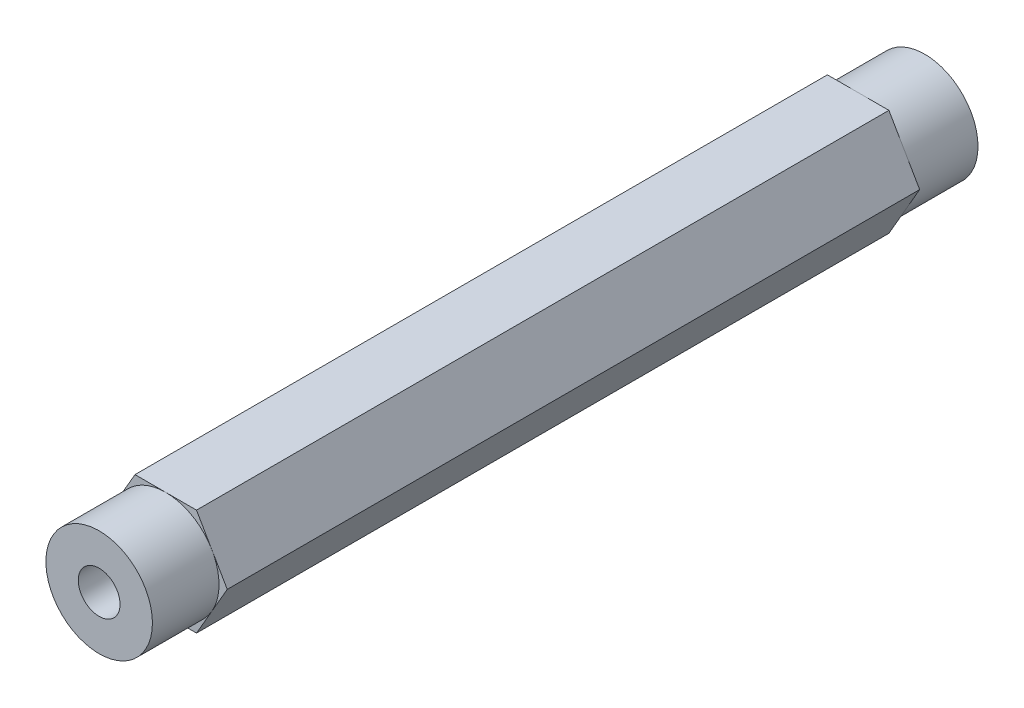
ISO-10303-21;
HEADER;
FILE_DESCRIPTION(('STEP AP214'),'2;1');
FILE_NAME('part.step','',(''),(''),'','','');
FILE_SCHEMA(('AUTOMOTIVE_DESIGN { 1 0 10303 214 1 1 1 1 }'));
ENDSEC;
DATA;
#1=APPLICATION_CONTEXT('core data for automotive mechanical design processes');
#2=APPLICATION_PROTOCOL_DEFINITION('international standard','automotive_design',2000,#1);
#3=PRODUCT_CONTEXT('',#1,'mechanical');
#4=PRODUCT('Part','Part','',(#3));
#5=PRODUCT_RELATED_PRODUCT_CATEGORY('part','',(#4));
#6=PRODUCT_DEFINITION_FORMATION('','',#4);
#7=PRODUCT_DEFINITION_CONTEXT('part definition',#1,'design');
#8=PRODUCT_DEFINITION('design','',#6,#7);
#9=PRODUCT_DEFINITION_SHAPE('','',#8);
#10=(LENGTH_UNIT() NAMED_UNIT(*) SI_UNIT(.MILLI.,.METRE.));
#11=(NAMED_UNIT(*) PLANE_ANGLE_UNIT() SI_UNIT($,.RADIAN.));
#12=(NAMED_UNIT(*) SI_UNIT($,.STERADIAN.) SOLID_ANGLE_UNIT());
#13=UNCERTAINTY_MEASURE_WITH_UNIT(LENGTH_MEASURE(1.E-05),#10,'distance_accuracy_value','');
#14=(GEOMETRIC_REPRESENTATION_CONTEXT(3) GLOBAL_UNCERTAINTY_ASSIGNED_CONTEXT((#13)) GLOBAL_UNIT_ASSIGNED_CONTEXT((#10,
#11,#12)) REPRESENTATION_CONTEXT('',''));
#15=CARTESIAN_POINT('',(0.,0.,0.));
#16=DIRECTION('',(0.,0.,1.));
#17=DIRECTION('',(1.,0.,0.));
#18=AXIS2_PLACEMENT_3D('',#15,#16,#17);
#19=CARTESIAN_POINT('',(7.33234841870825,0.,49.2125));
#20=DIRECTION('',(-0.866025403784439,-0.5,0.));
#21=DIRECTION('',(0.5,-0.866025403784439,0.));
#22=AXIS2_PLACEMENT_3D('',#19,#20,#21);
#23=PLANE('',#22);
#24=DIRECTION('',(0.5,-0.866025403784439,0.));
#25=VECTOR('',#24,1.);
#26=CARTESIAN_POINT('',(7.33234841870825,0.,-41.275));
#27=LINE('',#26,#25);
#28=CARTESIAN_POINT('',(3.66617420935413,6.35,-41.275));
#29=VERTEX_POINT('',#28);
#30=CARTESIAN_POINT('',(5.49926131403119,3.175,-41.275));
#31=VERTEX_POINT('',#30);
#32=EDGE_CURVE('E129',#29,#31,#27,.T.);
#33=ORIENTED_EDGE('',*,*,#32,.F.);
#34=DIRECTION('',(0.,0.,-1.));
#35=VECTOR('',#34,1.);
#36=CARTESIAN_POINT('',(3.66617420935412,6.35,49.2125));
#37=LINE('',#36,#35);
#38=CARTESIAN_POINT('',(3.66617420935412,6.35,41.275));
#39=VERTEX_POINT('',#38);
#40=EDGE_CURVE('E213',#39,#29,#37,.T.);
#41=ORIENTED_EDGE('',*,*,#40,.F.);
#42=DIRECTION('',(-0.5,0.866025403784439,0.));
#43=VECTOR('',#42,1.);
#44=CARTESIAN_POINT('',(7.33234841870825,0.,41.275));
#45=LINE('',#44,#43);
#46=CARTESIAN_POINT('',(5.49926131403119,3.175,41.275));
#47=VERTEX_POINT('',#46);
#48=EDGE_CURVE('E191',#47,#39,#45,.T.);
#49=ORIENTED_EDGE('',*,*,#48,.F.);
#50=CARTESIAN_POINT('',(7.33234841870825,0.,41.275));
#51=VERTEX_POINT('',#50);
#52=EDGE_CURVE('E193',#51,#47,#45,.T.);
#53=ORIENTED_EDGE('',*,*,#52,.F.);
#54=DIRECTION('',(0.,0.,-1.));
#55=VECTOR('',#54,1.);
#56=CARTESIAN_POINT('',(7.33234841870825,0.,49.2125));
#57=LINE('',#56,#55);
#58=CARTESIAN_POINT('',(7.33234841870825,0.,-41.275));
#59=VERTEX_POINT('',#58);
#60=EDGE_CURVE('E160',#51,#59,#57,.T.);
#61=ORIENTED_EDGE('',*,*,#60,.T.);
#62=EDGE_CURVE('E141',#31,#59,#27,.T.);
#63=ORIENTED_EDGE('',*,*,#62,.F.);
#64=EDGE_LOOP('',(#33,#41,#49,#53,#61,#63));
#65=FACE_BOUND('',#64,.T.);
#66=ADVANCED_FACE('F39',(#65),#23,.F.);
#67=CARTESIAN_POINT('',(3.66617420935412,6.35,49.2125));
#68=DIRECTION('',(0.,-1.,0.));
#69=DIRECTION('',(1.,0.,0.));
#70=AXIS2_PLACEMENT_3D('',#67,#68,#69);
#71=PLANE('',#70);
#72=DIRECTION('',(1.,0.,0.));
#73=VECTOR('',#72,1.);
#74=CARTESIAN_POINT('',(3.66617420935412,6.35,-41.275));
#75=LINE('',#74,#73);
#76=CARTESIAN_POINT('',(-3.66617420935413,6.35,-41.275));
#77=VERTEX_POINT('',#76);
#78=CARTESIAN_POINT('',(0.,6.35,-41.275));
#79=VERTEX_POINT('',#78);
#80=EDGE_CURVE('E167',#77,#79,#75,.T.);
#81=ORIENTED_EDGE('',*,*,#80,.F.);
#82=DIRECTION('',(0.,0.,-1.));
#83=VECTOR('',#82,1.);
#84=CARTESIAN_POINT('',(-3.66617420935412,6.35,49.2125));
#85=LINE('',#84,#83);
#86=CARTESIAN_POINT('',(-3.66617420935412,6.35,41.275));
#87=VERTEX_POINT('',#86);
#88=EDGE_CURVE('E210',#87,#77,#85,.T.);
#89=ORIENTED_EDGE('',*,*,#88,.F.);
#90=DIRECTION('',(-1.,0.,0.));
#91=VECTOR('',#90,1.);
#92=CARTESIAN_POINT('',(3.66617420935412,6.35,41.275));
#93=LINE('',#92,#91);
#94=CARTESIAN_POINT('',(0.,6.35,41.275));
#95=VERTEX_POINT('',#94);
#96=EDGE_CURVE('E188',#95,#87,#93,.T.);
#97=ORIENTED_EDGE('',*,*,#96,.F.);
#98=EDGE_CURVE('E190',#39,#95,#93,.T.);
#99=ORIENTED_EDGE('',*,*,#98,.F.);
#100=ORIENTED_EDGE('',*,*,#40,.T.);
#101=EDGE_CURVE('E135',#79,#29,#75,.T.);
#102=ORIENTED_EDGE('',*,*,#101,.F.);
#103=EDGE_LOOP('',(#81,#89,#97,#99,#100,#102));
#104=FACE_BOUND('',#103,.T.);
#105=ADVANCED_FACE('F241',(#104),#71,.F.);
#106=CARTESIAN_POINT('',(-3.66617420935412,6.35,49.2125));
#107=DIRECTION('',(0.866025403784439,-0.5,0.));
#108=DIRECTION('',(0.5,0.866025403784439,0.));
#109=AXIS2_PLACEMENT_3D('',#106,#107,#108);
#110=PLANE('',#109);
#111=DIRECTION('',(0.5,0.866025403784439,0.));
#112=VECTOR('',#111,1.);
#113=CARTESIAN_POINT('',(-3.66617420935412,6.35,-41.275));
#114=LINE('',#113,#112);
#115=CARTESIAN_POINT('',(-7.33234841870825,0.,-41.275));
#116=VERTEX_POINT('',#115);
#117=CARTESIAN_POINT('',(-5.49926131403119,3.175,-41.275));
#118=VERTEX_POINT('',#117);
#119=EDGE_CURVE('E170',#116,#118,#114,.T.);
#120=ORIENTED_EDGE('',*,*,#119,.F.);
#121=DIRECTION('',(0.,0.,-1.));
#122=VECTOR('',#121,1.);
#123=CARTESIAN_POINT('',(-7.33234841870825,0.,49.2125));
#124=LINE('',#123,#122);
#125=CARTESIAN_POINT('',(-7.33234841870825,0.,41.275));
#126=VERTEX_POINT('',#125);
#127=EDGE_CURVE('E207',#126,#116,#124,.T.);
#128=ORIENTED_EDGE('',*,*,#127,.F.);
#129=DIRECTION('',(-0.5,-0.866025403784439,0.));
#130=VECTOR('',#129,1.);
#131=CARTESIAN_POINT('',(-3.66617420935412,6.35,41.275));
#132=LINE('',#131,#130);
#133=CARTESIAN_POINT('',(-5.49926131403119,3.175,41.275));
#134=VERTEX_POINT('',#133);
#135=EDGE_CURVE('E185',#134,#126,#132,.T.);
#136=ORIENTED_EDGE('',*,*,#135,.F.);
#137=EDGE_CURVE('E187',#87,#134,#132,.T.);
#138=ORIENTED_EDGE('',*,*,#137,.F.);
#139=ORIENTED_EDGE('',*,*,#88,.T.);
#140=EDGE_CURVE('E168',#118,#77,#114,.T.);
#141=ORIENTED_EDGE('',*,*,#140,.F.);
#142=EDGE_LOOP('',(#120,#128,#136,#138,#139,#141));
#143=FACE_BOUND('',#142,.T.);
#144=ADVANCED_FACE('F251',(#143),#110,.F.);
#145=CARTESIAN_POINT('',(-7.33234841870825,0.,49.2125));
#146=DIRECTION('',(0.866025403784438,0.5,0.));
#147=DIRECTION('',(-0.5,0.866025403784439,0.));
#148=AXIS2_PLACEMENT_3D('',#145,#146,#147);
#149=PLANE('',#148);
#150=DIRECTION('',(-0.5,0.866025403784439,0.));
#151=VECTOR('',#150,1.);
#152=CARTESIAN_POINT('',(-7.33234841870825,0.,-41.275));
#153=LINE('',#152,#151);
#154=CARTESIAN_POINT('',(-3.66617420935412,-6.35,-41.275));
#155=VERTEX_POINT('',#154);
#156=CARTESIAN_POINT('',(-5.49926131403118,-3.175,-41.275));
#157=VERTEX_POINT('',#156);
#158=EDGE_CURVE('E163',#155,#157,#153,.T.);
#159=ORIENTED_EDGE('',*,*,#158,.F.);
#160=DIRECTION('',(0.,0.,-1.));
#161=VECTOR('',#160,1.);
#162=CARTESIAN_POINT('',(-3.66617420935412,-6.35,49.2125));
#163=LINE('',#162,#161);
#164=CARTESIAN_POINT('',(-3.66617420935412,-6.35,41.275));
#165=VERTEX_POINT('',#164);
#166=EDGE_CURVE('E204',#165,#155,#163,.T.);
#167=ORIENTED_EDGE('',*,*,#166,.F.);
#168=DIRECTION('',(0.5,-0.866025403784439,0.));
#169=VECTOR('',#168,1.);
#170=CARTESIAN_POINT('',(-7.33234841870825,0.,41.275));
#171=LINE('',#170,#169);
#172=CARTESIAN_POINT('',(-5.49926131403118,-3.175,41.275));
#173=VERTEX_POINT('',#172);
#174=EDGE_CURVE('E182',#173,#165,#171,.T.);
#175=ORIENTED_EDGE('',*,*,#174,.F.);
#176=EDGE_CURVE('E184',#126,#173,#171,.T.);
#177=ORIENTED_EDGE('',*,*,#176,.F.);
#178=ORIENTED_EDGE('',*,*,#127,.T.);
#179=EDGE_CURVE('E165',#157,#116,#153,.T.);
#180=ORIENTED_EDGE('',*,*,#179,.F.);
#181=EDGE_LOOP('',(#159,#167,#175,#177,#178,#180));
#182=FACE_BOUND('',#181,.T.);
#183=ADVANCED_FACE('F263',(#182),#149,.F.);
#184=CARTESIAN_POINT('',(-3.66617420935412,-6.35,49.2125));
#185=DIRECTION('',(0.,1.,0.));
#186=DIRECTION('',(-1.,0.,0.));
#187=AXIS2_PLACEMENT_3D('',#184,#185,#186);
#188=PLANE('',#187);
#189=DIRECTION('',(-1.,0.,0.));
#190=VECTOR('',#189,1.);
#191=CARTESIAN_POINT('',(-3.66617420935412,-6.35,-41.275));
#192=LINE('',#191,#190);
#193=CARTESIAN_POINT('',(3.66617420935413,-6.35,-41.275));
#194=VERTEX_POINT('',#193);
#195=CARTESIAN_POINT('',(0.,-6.35,-41.275));
#196=VERTEX_POINT('',#195);
#197=EDGE_CURVE('E156',#194,#196,#192,.T.);
#198=ORIENTED_EDGE('',*,*,#197,.F.);
#199=DIRECTION('',(0.,0.,-1.));
#200=VECTOR('',#199,1.);
#201=CARTESIAN_POINT('',(3.66617420935413,-6.35,49.2125));
#202=LINE('',#201,#200);
#203=CARTESIAN_POINT('',(3.66617420935413,-6.35,41.275));
#204=VERTEX_POINT('',#203);
#205=EDGE_CURVE('E201',#204,#194,#202,.T.);
#206=ORIENTED_EDGE('',*,*,#205,.F.);
#207=DIRECTION('',(1.,0.,0.));
#208=VECTOR('',#207,1.);
#209=CARTESIAN_POINT('',(-3.66617420935412,-6.35,41.275));
#210=LINE('',#209,#208);
#211=CARTESIAN_POINT('',(0.,-6.35,41.275));
#212=VERTEX_POINT('',#211);
#213=EDGE_CURVE('E174',#212,#204,#210,.T.);
#214=ORIENTED_EDGE('',*,*,#213,.F.);
#215=EDGE_CURVE('E181',#165,#212,#210,.T.);
#216=ORIENTED_EDGE('',*,*,#215,.F.);
#217=ORIENTED_EDGE('',*,*,#166,.T.);
#218=EDGE_CURVE('E140',#196,#155,#192,.T.);
#219=ORIENTED_EDGE('',*,*,#218,.F.);
#220=EDGE_LOOP('',(#198,#206,#214,#216,#217,#219));
#221=FACE_BOUND('',#220,.T.);
#222=ADVANCED_FACE('F272',(#221),#188,.F.);
#223=CARTESIAN_POINT('',(3.66617420935413,-6.35,49.2125));
#224=DIRECTION('',(-0.866025403784439,0.5,0.));
#225=DIRECTION('',(-0.5,-0.866025403784439,0.));
#226=AXIS2_PLACEMENT_3D('',#223,#224,#225);
#227=PLANE('',#226);
#228=DIRECTION('',(-0.5,-0.866025403784439,0.));
#229=VECTOR('',#228,1.);
#230=CARTESIAN_POINT('',(3.66617420935413,-6.35,-41.275));
#231=LINE('',#230,#229);
#232=CARTESIAN_POINT('',(5.49926131403119,-3.175,-41.275));
#233=VERTEX_POINT('',#232);
#234=EDGE_CURVE('E12',#59,#233,#231,.T.);
#235=ORIENTED_EDGE('',*,*,#234,.F.);
#236=ORIENTED_EDGE('',*,*,#60,.F.);
#237=DIRECTION('',(0.5,0.866025403784439,0.));
#238=VECTOR('',#237,1.);
#239=CARTESIAN_POINT('',(3.66617420935413,-6.35,41.275));
#240=LINE('',#239,#238);
#241=CARTESIAN_POINT('',(5.49926131403119,-3.175,41.275));
#242=VERTEX_POINT('',#241);
#243=EDGE_CURVE('E215',#242,#51,#240,.T.);
#244=ORIENTED_EDGE('',*,*,#243,.F.);
#245=EDGE_CURVE('E216',#204,#242,#240,.T.);
#246=ORIENTED_EDGE('',*,*,#245,.F.);
#247=ORIENTED_EDGE('',*,*,#205,.T.);
#248=EDGE_CURVE('E42',#233,#194,#231,.T.);
#249=ORIENTED_EDGE('',*,*,#248,.F.);
#250=EDGE_LOOP('',(#235,#236,#244,#246,#247,#249));
#251=FACE_BOUND('',#250,.T.);
#252=ADVANCED_FACE('F229',(#251),#227,.F.);
#253=CARTESIAN_POINT('',(0.,0.,-49.2125));
#254=DIRECTION('',(0.,0.,1.));
#255=DIRECTION('',(1.,0.,0.));
#256=AXIS2_PLACEMENT_3D('',#253,#254,#255);
#257=PLANE('',#256);
#258=CARTESIAN_POINT('',(0.,0.,-49.2125));
#259=DIRECTION('',(0.,0.,1.));
#260=DIRECTION('',(1.,0.,0.));
#261=AXIS2_PLACEMENT_3D('',#258,#259,#260);
#262=CIRCLE('',#261,2.4892);
#263=CARTESIAN_POINT('',(2.4892,0.,-49.2125));
#264=VERTEX_POINT('',#263);
#265=EDGE_CURVE('E197',#264,#264,#262,.T.);
#266=ORIENTED_EDGE('',*,*,#265,.T.);
#267=EDGE_LOOP('',(#266));
#268=FACE_BOUND('',#267,.T.);
#269=CARTESIAN_POINT('',(0.,0.,-49.2125));
#270=DIRECTION('',(0.,0.,1.));
#271=DIRECTION('',(1.,0.,0.));
#272=AXIS2_PLACEMENT_3D('',#269,#270,#271);
#273=CIRCLE('',#272,6.35);
#274=CARTESIAN_POINT('',(6.35,0.,-49.2125));
#275=VERTEX_POINT('',#274);
#276=EDGE_CURVE('E217',#275,#275,#273,.F.);
#277=ORIENTED_EDGE('',*,*,#276,.T.);
#278=EDGE_LOOP('',(#277));
#279=FACE_BOUND('',#278,.T.);
#280=ADVANCED_FACE('F312',(#268,#279),#257,.F.);
#281=CARTESIAN_POINT('',(0.,0.,49.2125));
#282=DIRECTION('',(0.,0.,1.));
#283=DIRECTION('',(1.,0.,0.));
#284=AXIS2_PLACEMENT_3D('',#281,#282,#283);
#285=PLANE('',#284);
#286=CARTESIAN_POINT('',(0.,0.,49.2125));
#287=DIRECTION('',(0.,0.,1.));
#288=DIRECTION('',(1.,0.,0.));
#289=AXIS2_PLACEMENT_3D('',#286,#287,#288);
#290=CIRCLE('',#289,2.4892);
#291=CARTESIAN_POINT('',(2.4892,0.,49.2125));
#292=VERTEX_POINT('',#291);
#293=EDGE_CURVE('E194',#292,#292,#290,.T.);
#294=ORIENTED_EDGE('',*,*,#293,.F.);
#295=EDGE_LOOP('',(#294));
#296=FACE_BOUND('',#295,.T.);
#297=CARTESIAN_POINT('',(0.,0.,49.2125));
#298=DIRECTION('',(0.,0.,1.));
#299=DIRECTION('',(1.,0.,0.));
#300=AXIS2_PLACEMENT_3D('',#297,#298,#299);
#301=CIRCLE('',#300,6.35);
#302=CARTESIAN_POINT('',(6.35,0.,49.2125));
#303=VERTEX_POINT('',#302);
#304=EDGE_CURVE('E177',#303,#303,#301,.T.);
#305=ORIENTED_EDGE('',*,*,#304,.T.);
#306=EDGE_LOOP('',(#305));
#307=FACE_BOUND('',#306,.T.);
#308=ADVANCED_FACE('F315',(#296,#307),#285,.T.);
#309=CARTESIAN_POINT('',(0.,0.,49.2125));
#310=DIRECTION('',(0.,0.,-1.));
#311=DIRECTION('',(-1.,0.,0.));
#312=AXIS2_PLACEMENT_3D('',#309,#310,#311);
#313=CYLINDRICAL_SURFACE('',#312,2.4892);
#314=ORIENTED_EDGE('',*,*,#293,.T.);
#315=EDGE_LOOP('',(#314));
#316=FACE_BOUND('',#315,.T.);
#317=ORIENTED_EDGE('',*,*,#265,.F.);
#318=EDGE_LOOP('',(#317));
#319=FACE_BOUND('',#318,.T.);
#320=ADVANCED_FACE('F319',(#316,#319),#313,.F.);
#321=CARTESIAN_POINT('',(0.,0.,41.275));
#322=DIRECTION('',(0.,0.,1.));
#323=DIRECTION('',(1.,0.,0.));
#324=AXIS2_PLACEMENT_3D('',#321,#322,#323);
#325=PLANE('',#324);
#326=ORIENTED_EDGE('',*,*,#52,.T.);
#327=CARTESIAN_POINT('',(0.,0.,41.275));
#328=DIRECTION('',(0.,0.,1.));
#329=DIRECTION('',(1.,0.,0.));
#330=AXIS2_PLACEMENT_3D('',#327,#328,#329);
#331=CIRCLE('',#330,6.35);
#332=EDGE_CURVE('E176',#242,#47,#331,.T.);
#333=ORIENTED_EDGE('',*,*,#332,.F.);
#334=ORIENTED_EDGE('',*,*,#243,.T.);
#335=EDGE_LOOP('',(#326,#333,#334));
#336=FACE_BOUND('',#335,.T.);
#337=ADVANCED_FACE('F231',(#336),#325,.T.);
#338=ORIENTED_EDGE('',*,*,#48,.T.);
#339=ORIENTED_EDGE('',*,*,#98,.T.);
#340=EDGE_CURVE('E171',#47,#95,#331,.T.);
#341=ORIENTED_EDGE('',*,*,#340,.F.);
#342=EDGE_LOOP('',(#338,#339,#341));
#343=FACE_BOUND('',#342,.T.);
#344=ADVANCED_FACE('F236',(#343),#325,.T.);
#345=ORIENTED_EDGE('',*,*,#96,.T.);
#346=ORIENTED_EDGE('',*,*,#137,.T.);
#347=EDGE_CURVE('E175',#95,#134,#331,.T.);
#348=ORIENTED_EDGE('',*,*,#347,.F.);
#349=EDGE_LOOP('',(#345,#346,#348));
#350=FACE_BOUND('',#349,.T.);
#351=ADVANCED_FACE('F245',(#350),#325,.T.);
#352=ORIENTED_EDGE('',*,*,#135,.T.);
#353=ORIENTED_EDGE('',*,*,#176,.T.);
#354=EDGE_CURVE('E259',#134,#173,#331,.T.);
#355=ORIENTED_EDGE('',*,*,#354,.F.);
#356=EDGE_LOOP('',(#352,#353,#355));
#357=FACE_BOUND('',#356,.T.);
#358=ADVANCED_FACE('F256',(#357),#325,.T.);
#359=ORIENTED_EDGE('',*,*,#174,.T.);
#360=ORIENTED_EDGE('',*,*,#215,.T.);
#361=EDGE_CURVE('E269',#173,#212,#331,.T.);
#362=ORIENTED_EDGE('',*,*,#361,.F.);
#363=EDGE_LOOP('',(#359,#360,#362));
#364=FACE_BOUND('',#363,.T.);
#365=ADVANCED_FACE('F268',(#364),#325,.T.);
#366=ORIENTED_EDGE('',*,*,#213,.T.);
#367=ORIENTED_EDGE('',*,*,#245,.T.);
#368=EDGE_CURVE('E61',#212,#242,#331,.T.);
#369=ORIENTED_EDGE('',*,*,#368,.F.);
#370=EDGE_LOOP('',(#366,#367,#369));
#371=FACE_BOUND('',#370,.T.);
#372=ADVANCED_FACE('F225',(#371),#325,.T.);
#373=CARTESIAN_POINT('',(0.,0.,41.275));
#374=DIRECTION('',(0.,0.,1.));
#375=DIRECTION('',(1.,0.,0.));
#376=AXIS2_PLACEMENT_3D('',#373,#374,#375);
#377=CYLINDRICAL_SURFACE('',#376,6.35);
#378=ORIENTED_EDGE('',*,*,#304,.F.);
#379=EDGE_LOOP('',(#378));
#380=FACE_BOUND('',#379,.T.);
#381=ORIENTED_EDGE('',*,*,#332,.T.);
#382=ORIENTED_EDGE('',*,*,#340,.T.);
#383=ORIENTED_EDGE('',*,*,#347,.T.);
#384=ORIENTED_EDGE('',*,*,#354,.T.);
#385=ORIENTED_EDGE('',*,*,#361,.T.);
#386=ORIENTED_EDGE('',*,*,#368,.T.);
#387=EDGE_LOOP('',(#381,#382,#383,#384,#385,#386));
#388=FACE_BOUND('',#387,.T.);
#389=ADVANCED_FACE('F287',(#380,#388),#377,.T.);
#390=CARTESIAN_POINT('',(0.,0.,-41.275));
#391=DIRECTION('',(0.,0.,-1.));
#392=DIRECTION('',(-1.,0.,0.));
#393=AXIS2_PLACEMENT_3D('',#390,#391,#392);
#394=PLANE('',#393);
#395=ORIENTED_EDGE('',*,*,#119,.T.);
#396=CARTESIAN_POINT('',(0.,0.,-41.275));
#397=DIRECTION('',(0.,0.,1.));
#398=DIRECTION('',(1.,0.,0.));
#399=AXIS2_PLACEMENT_3D('',#396,#397,#398);
#400=CIRCLE('',#399,6.35);
#401=EDGE_CURVE('E281',#118,#157,#400,.T.);
#402=ORIENTED_EDGE('',*,*,#401,.T.);
#403=ORIENTED_EDGE('',*,*,#179,.T.);
#404=EDGE_LOOP('',(#395,#402,#403));
#405=FACE_BOUND('',#404,.T.);
#406=ADVANCED_FACE('F285',(#405),#394,.T.);
#407=ORIENTED_EDGE('',*,*,#140,.T.);
#408=ORIENTED_EDGE('',*,*,#80,.T.);
#409=EDGE_CURVE('E155',#79,#118,#400,.T.);
#410=ORIENTED_EDGE('',*,*,#409,.T.);
#411=EDGE_LOOP('',(#407,#408,#410));
#412=FACE_BOUND('',#411,.T.);
#413=ADVANCED_FACE('F284',(#412),#394,.T.);
#414=ORIENTED_EDGE('',*,*,#101,.T.);
#415=ORIENTED_EDGE('',*,*,#32,.T.);
#416=EDGE_CURVE('E133',#31,#79,#400,.T.);
#417=ORIENTED_EDGE('',*,*,#416,.T.);
#418=EDGE_LOOP('',(#414,#415,#417));
#419=FACE_BOUND('',#418,.T.);
#420=ADVANCED_FACE('F131',(#419),#394,.T.);
#421=ORIENTED_EDGE('',*,*,#158,.T.);
#422=EDGE_CURVE('E277',#157,#196,#400,.T.);
#423=ORIENTED_EDGE('',*,*,#422,.T.);
#424=ORIENTED_EDGE('',*,*,#218,.T.);
#425=EDGE_LOOP('',(#421,#423,#424));
#426=FACE_BOUND('',#425,.T.);
#427=ADVANCED_FACE('F280',(#426),#394,.T.);
#428=ORIENTED_EDGE('',*,*,#62,.T.);
#429=ORIENTED_EDGE('',*,*,#234,.T.);
#430=EDGE_CURVE('E144',#233,#31,#400,.T.);
#431=ORIENTED_EDGE('',*,*,#430,.T.);
#432=EDGE_LOOP('',(#428,#429,#431));
#433=FACE_BOUND('',#432,.T.);
#434=ADVANCED_FACE('F145',(#433),#394,.T.);
#435=ORIENTED_EDGE('',*,*,#197,.T.);
#436=EDGE_CURVE('E53',#196,#233,#400,.T.);
#437=ORIENTED_EDGE('',*,*,#436,.T.);
#438=ORIENTED_EDGE('',*,*,#248,.T.);
#439=EDGE_LOOP('',(#435,#437,#438));
#440=FACE_BOUND('',#439,.T.);
#441=ADVANCED_FACE('F274',(#440),#394,.T.);
#442=CARTESIAN_POINT('',(0.,0.,-41.275));
#443=DIRECTION('',(0.,0.,-1.));
#444=DIRECTION('',(-1.,0.,0.));
#445=AXIS2_PLACEMENT_3D('',#442,#443,#444);
#446=CYLINDRICAL_SURFACE('',#445,6.35);
#447=ORIENTED_EDGE('',*,*,#416,.F.);
#448=ORIENTED_EDGE('',*,*,#430,.F.);
#449=ORIENTED_EDGE('',*,*,#436,.F.);
#450=ORIENTED_EDGE('',*,*,#422,.F.);
#451=ORIENTED_EDGE('',*,*,#401,.F.);
#452=ORIENTED_EDGE('',*,*,#409,.F.);
#453=EDGE_LOOP('',(#447,#448,#449,#450,#451,#452));
#454=FACE_BOUND('',#453,.T.);
#455=ORIENTED_EDGE('',*,*,#276,.F.);
#456=EDGE_LOOP('',(#455));
#457=FACE_BOUND('',#456,.T.);
#458=ADVANCED_FACE('F151',(#454,#457),#446,.T.);
#459=CLOSED_SHELL('',(#66,#105,#144,#183,#222,#252,#280,#308,#320,#337,#344,#351,#358,#365,#372,
#389,#406,#413,#420,#427,#434,#441,#458));
#460=MANIFOLD_SOLID_BREP('B2',#459);
#461=ADVANCED_BREP_SHAPE_REPRESENTATION('',(#18,#460),#14);
#462=SHAPE_DEFINITION_REPRESENTATION(#9,#461);
ENDSEC;
END-ISO-10303-21;
